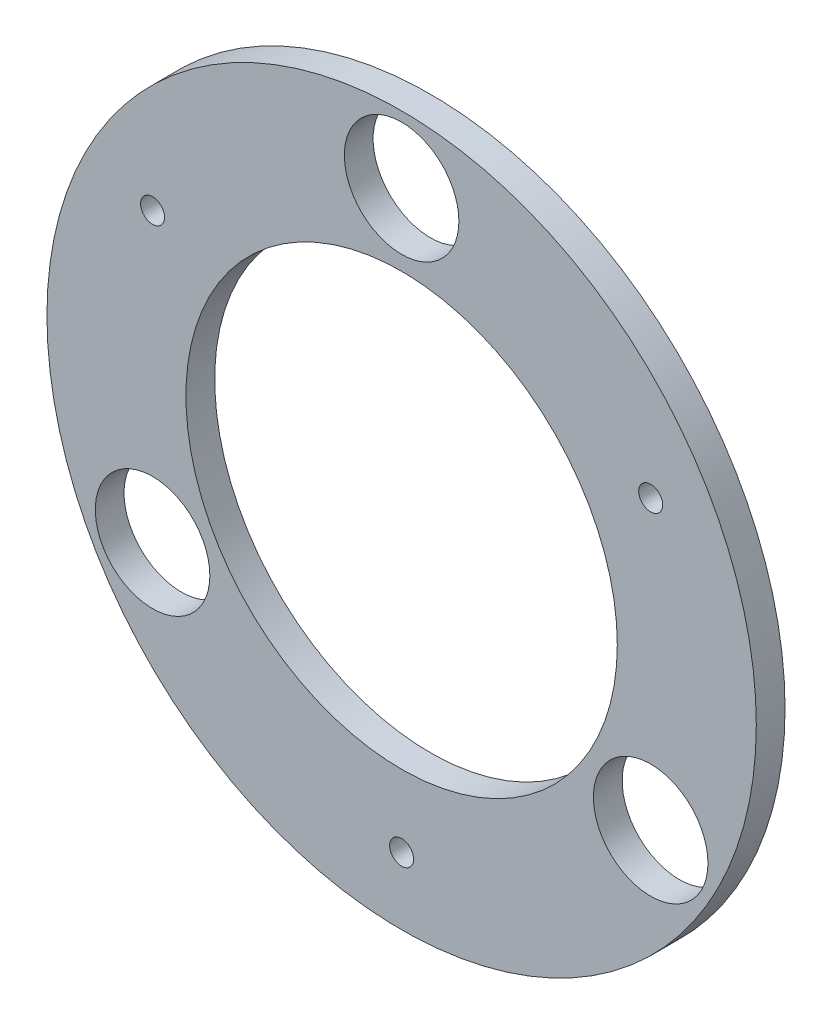
ISO-10303-21;
HEADER;
FILE_DESCRIPTION(('STEP AP214'),'2;1');
FILE_NAME('part.step','',(''),(''),'','','');
FILE_SCHEMA(('AUTOMOTIVE_DESIGN { 1 0 10303 214 1 1 1 1 }'));
ENDSEC;
DATA;
#1=APPLICATION_CONTEXT('core data for automotive mechanical design processes');
#2=APPLICATION_PROTOCOL_DEFINITION('international standard','automotive_design',2000,#1);
#3=PRODUCT_CONTEXT('',#1,'mechanical');
#4=PRODUCT('Part','Part','',(#3));
#5=PRODUCT_RELATED_PRODUCT_CATEGORY('part','',(#4));
#6=PRODUCT_DEFINITION_FORMATION('','',#4);
#7=PRODUCT_DEFINITION_CONTEXT('part definition',#1,'design');
#8=PRODUCT_DEFINITION('design','',#6,#7);
#9=PRODUCT_DEFINITION_SHAPE('','',#8);
#10=(LENGTH_UNIT() NAMED_UNIT(*) SI_UNIT(.MILLI.,.METRE.));
#11=(NAMED_UNIT(*) PLANE_ANGLE_UNIT() SI_UNIT($,.RADIAN.));
#12=(NAMED_UNIT(*) SI_UNIT($,.STERADIAN.) SOLID_ANGLE_UNIT());
#13=UNCERTAINTY_MEASURE_WITH_UNIT(LENGTH_MEASURE(1.E-05),#10,'distance_accuracy_value','');
#14=(GEOMETRIC_REPRESENTATION_CONTEXT(3) GLOBAL_UNCERTAINTY_ASSIGNED_CONTEXT((#13)) GLOBAL_UNIT_ASSIGNED_CONTEXT((#10,
#11,#12)) REPRESENTATION_CONTEXT('',''));
#15=CARTESIAN_POINT('',(0.,0.,0.));
#16=DIRECTION('',(0.,0.,1.));
#17=DIRECTION('',(1.,0.,0.));
#18=AXIS2_PLACEMENT_3D('',#15,#16,#17);
#19=CARTESIAN_POINT('',(0.,0.,3.));
#20=DIRECTION('',(0.,0.,1.));
#21=DIRECTION('',(1.,0.,0.));
#22=AXIS2_PLACEMENT_3D('',#19,#20,#21);
#23=PLANE('',#22);
#24=CARTESIAN_POINT('',(-25.9807621135332,15.,3.));
#25=DIRECTION('',(0.,0.,1.));
#26=DIRECTION('',(1.,0.,0.));
#27=AXIS2_PLACEMENT_3D('',#24,#25,#26);
#28=CIRCLE('',#27,1.25);
#29=CARTESIAN_POINT('',(-24.7307621135332,15.,3.));
#30=VERTEX_POINT('',#29);
#31=EDGE_CURVE('E55',#30,#30,#28,.T.);
#32=ORIENTED_EDGE('',*,*,#31,.F.);
#33=EDGE_LOOP('',(#32));
#34=FACE_BOUND('',#33,.T.);
#35=CARTESIAN_POINT('',(25.9807621135332,-15.,3.));
#36=DIRECTION('',(0.,0.,1.));
#37=DIRECTION('',(1.,0.,0.));
#38=AXIS2_PLACEMENT_3D('',#35,#36,#37);
#39=CIRCLE('',#38,5.975);
#40=CARTESIAN_POINT('',(31.9557621135332,-15.,3.));
#41=VERTEX_POINT('',#40);
#42=EDGE_CURVE('E43',#41,#41,#39,.T.);
#43=ORIENTED_EDGE('',*,*,#42,.F.);
#44=EDGE_LOOP('',(#43));
#45=FACE_BOUND('',#44,.T.);
#46=CARTESIAN_POINT('',(0.,30.,3.));
#47=DIRECTION('',(0.,0.,1.));
#48=DIRECTION('',(1.,0.,0.));
#49=AXIS2_PLACEMENT_3D('',#46,#47,#48);
#50=CIRCLE('',#49,5.975);
#51=CARTESIAN_POINT('',(5.97500000000001,30.,3.));
#52=VERTEX_POINT('',#51);
#53=EDGE_CURVE('E31',#52,#52,#50,.T.);
#54=ORIENTED_EDGE('',*,*,#53,.F.);
#55=EDGE_LOOP('',(#54));
#56=FACE_BOUND('',#55,.T.);
#57=CARTESIAN_POINT('',(0.,0.,3.));
#58=DIRECTION('',(0.,0.,1.));
#59=DIRECTION('',(1.,0.,0.));
#60=AXIS2_PLACEMENT_3D('',#57,#58,#59);
#61=CIRCLE('',#60,37.);
#62=CARTESIAN_POINT('',(37.,0.,3.));
#63=VERTEX_POINT('',#62);
#64=EDGE_CURVE('E10',#63,#63,#61,.T.);
#65=ORIENTED_EDGE('',*,*,#64,.T.);
#66=EDGE_LOOP('',(#65));
#67=FACE_BOUND('',#66,.T.);
#68=CARTESIAN_POINT('',(0.,0.,3.));
#69=DIRECTION('',(0.,0.,1.));
#70=DIRECTION('',(1.,0.,0.));
#71=AXIS2_PLACEMENT_3D('',#68,#69,#70);
#72=CIRCLE('',#71,22.5);
#73=CARTESIAN_POINT('',(22.5,0.,3.));
#74=VERTEX_POINT('',#73);
#75=EDGE_CURVE('E26',#74,#74,#72,.T.);
#76=ORIENTED_EDGE('',*,*,#75,.F.);
#77=EDGE_LOOP('',(#76));
#78=FACE_BOUND('',#77,.T.);
#79=CARTESIAN_POINT('',(-25.9807621135332,-15.,3.));
#80=DIRECTION('',(0.,0.,1.));
#81=DIRECTION('',(1.,0.,0.));
#82=AXIS2_PLACEMENT_3D('',#79,#80,#81);
#83=CIRCLE('',#82,5.975);
#84=CARTESIAN_POINT('',(-20.0057621135332,-15.,3.));
#85=VERTEX_POINT('',#84);
#86=EDGE_CURVE('E37',#85,#85,#83,.T.);
#87=ORIENTED_EDGE('',*,*,#86,.F.);
#88=EDGE_LOOP('',(#87));
#89=FACE_BOUND('',#88,.T.);
#90=CARTESIAN_POINT('',(25.9807621135332,15.,3.));
#91=DIRECTION('',(0.,0.,1.));
#92=DIRECTION('',(1.,0.,0.));
#93=AXIS2_PLACEMENT_3D('',#90,#91,#92);
#94=CIRCLE('',#93,1.25);
#95=CARTESIAN_POINT('',(27.2307621135332,15.,3.));
#96=VERTEX_POINT('',#95);
#97=EDGE_CURVE('E49',#96,#96,#94,.T.);
#98=ORIENTED_EDGE('',*,*,#97,.F.);
#99=EDGE_LOOP('',(#98));
#100=FACE_BOUND('',#99,.T.);
#101=CARTESIAN_POINT('',(0.,-30.,3.));
#102=DIRECTION('',(0.,0.,1.));
#103=DIRECTION('',(1.,0.,0.));
#104=AXIS2_PLACEMENT_3D('',#101,#102,#103);
#105=CIRCLE('',#104,1.25);
#106=CARTESIAN_POINT('',(1.25000000000001,-30.,3.));
#107=VERTEX_POINT('',#106);
#108=EDGE_CURVE('E61',#107,#107,#105,.T.);
#109=ORIENTED_EDGE('',*,*,#108,.F.);
#110=EDGE_LOOP('',(#109));
#111=FACE_BOUND('',#110,.T.);
#112=ADVANCED_FACE('F15',(#34,#45,#56,#67,#78,#89,#100,#111),#23,.T.);
#113=CARTESIAN_POINT('',(0.,0.,0.));
#114=DIRECTION('',(0.,0.,1.));
#115=DIRECTION('',(1.,0.,0.));
#116=AXIS2_PLACEMENT_3D('',#113,#114,#115);
#117=PLANE('',#116);
#118=CARTESIAN_POINT('',(0.,0.,0.));
#119=DIRECTION('',(0.,0.,1.));
#120=DIRECTION('',(1.,0.,0.));
#121=AXIS2_PLACEMENT_3D('',#118,#119,#120);
#122=CIRCLE('',#121,37.);
#123=CARTESIAN_POINT('',(37.,0.,0.));
#124=VERTEX_POINT('',#123);
#125=EDGE_CURVE('E19',#124,#124,#122,.T.);
#126=ORIENTED_EDGE('',*,*,#125,.F.);
#127=EDGE_LOOP('',(#126));
#128=FACE_BOUND('',#127,.T.);
#129=CARTESIAN_POINT('',(0.,0.,0.));
#130=DIRECTION('',(0.,0.,1.));
#131=DIRECTION('',(1.,0.,0.));
#132=AXIS2_PLACEMENT_3D('',#129,#130,#131);
#133=CIRCLE('',#132,22.5);
#134=CARTESIAN_POINT('',(22.5,0.,0.));
#135=VERTEX_POINT('',#134);
#136=EDGE_CURVE('E28',#135,#135,#133,.T.);
#137=ORIENTED_EDGE('',*,*,#136,.T.);
#138=EDGE_LOOP('',(#137));
#139=FACE_BOUND('',#138,.T.);
#140=CARTESIAN_POINT('',(0.,30.,0.));
#141=DIRECTION('',(0.,0.,1.));
#142=DIRECTION('',(1.,0.,0.));
#143=AXIS2_PLACEMENT_3D('',#140,#141,#142);
#144=CIRCLE('',#143,5.975);
#145=CARTESIAN_POINT('',(5.97500000000001,30.,0.));
#146=VERTEX_POINT('',#145);
#147=EDGE_CURVE('E34',#146,#146,#144,.T.);
#148=ORIENTED_EDGE('',*,*,#147,.T.);
#149=EDGE_LOOP('',(#148));
#150=FACE_BOUND('',#149,.T.);
#151=CARTESIAN_POINT('',(-25.9807621135332,-15.,0.));
#152=DIRECTION('',(0.,0.,1.));
#153=DIRECTION('',(1.,0.,0.));
#154=AXIS2_PLACEMENT_3D('',#151,#152,#153);
#155=CIRCLE('',#154,5.975);
#156=CARTESIAN_POINT('',(-20.0057621135332,-15.,0.));
#157=VERTEX_POINT('',#156);
#158=EDGE_CURVE('E40',#157,#157,#155,.T.);
#159=ORIENTED_EDGE('',*,*,#158,.T.);
#160=EDGE_LOOP('',(#159));
#161=FACE_BOUND('',#160,.T.);
#162=CARTESIAN_POINT('',(25.9807621135332,-15.,0.));
#163=DIRECTION('',(0.,0.,1.));
#164=DIRECTION('',(1.,0.,0.));
#165=AXIS2_PLACEMENT_3D('',#162,#163,#164);
#166=CIRCLE('',#165,5.975);
#167=CARTESIAN_POINT('',(31.9557621135332,-15.,0.));
#168=VERTEX_POINT('',#167);
#169=EDGE_CURVE('E46',#168,#168,#166,.T.);
#170=ORIENTED_EDGE('',*,*,#169,.T.);
#171=EDGE_LOOP('',(#170));
#172=FACE_BOUND('',#171,.T.);
#173=CARTESIAN_POINT('',(25.9807621135332,15.,0.));
#174=DIRECTION('',(0.,0.,1.));
#175=DIRECTION('',(1.,0.,0.));
#176=AXIS2_PLACEMENT_3D('',#173,#174,#175);
#177=CIRCLE('',#176,1.25);
#178=CARTESIAN_POINT('',(27.2307621135332,15.,0.));
#179=VERTEX_POINT('',#178);
#180=EDGE_CURVE('E52',#179,#179,#177,.T.);
#181=ORIENTED_EDGE('',*,*,#180,.T.);
#182=EDGE_LOOP('',(#181));
#183=FACE_BOUND('',#182,.T.);
#184=CARTESIAN_POINT('',(-25.9807621135332,15.,0.));
#185=DIRECTION('',(0.,0.,1.));
#186=DIRECTION('',(1.,0.,0.));
#187=AXIS2_PLACEMENT_3D('',#184,#185,#186);
#188=CIRCLE('',#187,1.25);
#189=CARTESIAN_POINT('',(-24.7307621135332,15.,0.));
#190=VERTEX_POINT('',#189);
#191=EDGE_CURVE('E58',#190,#190,#188,.T.);
#192=ORIENTED_EDGE('',*,*,#191,.T.);
#193=EDGE_LOOP('',(#192));
#194=FACE_BOUND('',#193,.T.);
#195=CARTESIAN_POINT('',(0.,-30.,0.));
#196=DIRECTION('',(0.,0.,1.));
#197=DIRECTION('',(1.,0.,0.));
#198=AXIS2_PLACEMENT_3D('',#195,#196,#197);
#199=CIRCLE('',#198,1.25);
#200=CARTESIAN_POINT('',(1.25000000000001,-30.,0.));
#201=VERTEX_POINT('',#200);
#202=EDGE_CURVE('E64',#201,#201,#199,.T.);
#203=ORIENTED_EDGE('',*,*,#202,.T.);
#204=EDGE_LOOP('',(#203));
#205=FACE_BOUND('',#204,.T.);
#206=ADVANCED_FACE('F74',(#128,#139,#150,#161,#172,#183,#194,#205),#117,.F.);
#207=CARTESIAN_POINT('',(0.,0.,3.));
#208=DIRECTION('',(0.,0.,-1.));
#209=DIRECTION('',(-1.,0.,0.));
#210=AXIS2_PLACEMENT_3D('',#207,#208,#209);
#211=CYLINDRICAL_SURFACE('',#210,37.);
#212=ORIENTED_EDGE('',*,*,#64,.F.);
#213=EDGE_LOOP('',(#212));
#214=FACE_BOUND('',#213,.T.);
#215=ORIENTED_EDGE('',*,*,#125,.T.);
#216=EDGE_LOOP('',(#215));
#217=FACE_BOUND('',#216,.T.);
#218=ADVANCED_FACE('F17',(#214,#217),#211,.T.);
#219=CARTESIAN_POINT('',(0.,0.,3.));
#220=DIRECTION('',(0.,0.,-1.));
#221=DIRECTION('',(-1.,0.,0.));
#222=AXIS2_PLACEMENT_3D('',#219,#220,#221);
#223=CYLINDRICAL_SURFACE('',#222,22.5);
#224=ORIENTED_EDGE('',*,*,#75,.T.);
#225=EDGE_LOOP('',(#224));
#226=FACE_BOUND('',#225,.T.);
#227=ORIENTED_EDGE('',*,*,#136,.F.);
#228=EDGE_LOOP('',(#227));
#229=FACE_BOUND('',#228,.T.);
#230=ADVANCED_FACE('F86',(#226,#229),#223,.F.);
#231=CARTESIAN_POINT('',(0.,30.,3.));
#232=DIRECTION('',(0.,0.,-1.));
#233=DIRECTION('',(-1.,0.,0.));
#234=AXIS2_PLACEMENT_3D('',#231,#232,#233);
#235=CYLINDRICAL_SURFACE('',#234,5.975);
#236=ORIENTED_EDGE('',*,*,#53,.T.);
#237=EDGE_LOOP('',(#236));
#238=FACE_BOUND('',#237,.T.);
#239=ORIENTED_EDGE('',*,*,#147,.F.);
#240=EDGE_LOOP('',(#239));
#241=FACE_BOUND('',#240,.T.);
#242=ADVANCED_FACE('F89',(#238,#241),#235,.F.);
#243=CARTESIAN_POINT('',(-25.9807621135332,-15.,3.));
#244=DIRECTION('',(0.,0.,-1.));
#245=DIRECTION('',(-1.,0.,0.));
#246=AXIS2_PLACEMENT_3D('',#243,#244,#245);
#247=CYLINDRICAL_SURFACE('',#246,5.975);
#248=ORIENTED_EDGE('',*,*,#86,.T.);
#249=EDGE_LOOP('',(#248));
#250=FACE_BOUND('',#249,.T.);
#251=ORIENTED_EDGE('',*,*,#158,.F.);
#252=EDGE_LOOP('',(#251));
#253=FACE_BOUND('',#252,.T.);
#254=ADVANCED_FACE('F93',(#250,#253),#247,.F.);
#255=CARTESIAN_POINT('',(25.9807621135332,-15.,3.));
#256=DIRECTION('',(0.,0.,-1.));
#257=DIRECTION('',(-1.,0.,0.));
#258=AXIS2_PLACEMENT_3D('',#255,#256,#257);
#259=CYLINDRICAL_SURFACE('',#258,5.975);
#260=ORIENTED_EDGE('',*,*,#42,.T.);
#261=EDGE_LOOP('',(#260));
#262=FACE_BOUND('',#261,.T.);
#263=ORIENTED_EDGE('',*,*,#169,.F.);
#264=EDGE_LOOP('',(#263));
#265=FACE_BOUND('',#264,.T.);
#266=ADVANCED_FACE('F97',(#262,#265),#259,.F.);
#267=CARTESIAN_POINT('',(25.9807621135332,15.,3.));
#268=DIRECTION('',(0.,0.,-1.));
#269=DIRECTION('',(-1.,0.,0.));
#270=AXIS2_PLACEMENT_3D('',#267,#268,#269);
#271=CYLINDRICAL_SURFACE('',#270,1.25);
#272=ORIENTED_EDGE('',*,*,#97,.T.);
#273=EDGE_LOOP('',(#272));
#274=FACE_BOUND('',#273,.T.);
#275=ORIENTED_EDGE('',*,*,#180,.F.);
#276=EDGE_LOOP('',(#275));
#277=FACE_BOUND('',#276,.T.);
#278=ADVANCED_FACE('F101',(#274,#277),#271,.F.);
#279=CARTESIAN_POINT('',(-25.9807621135332,15.,3.));
#280=DIRECTION('',(0.,0.,-1.));
#281=DIRECTION('',(-1.,0.,0.));
#282=AXIS2_PLACEMENT_3D('',#279,#280,#281);
#283=CYLINDRICAL_SURFACE('',#282,1.25);
#284=ORIENTED_EDGE('',*,*,#31,.T.);
#285=EDGE_LOOP('',(#284));
#286=FACE_BOUND('',#285,.T.);
#287=ORIENTED_EDGE('',*,*,#191,.F.);
#288=EDGE_LOOP('',(#287));
#289=FACE_BOUND('',#288,.T.);
#290=ADVANCED_FACE('F105',(#286,#289),#283,.F.);
#291=CARTESIAN_POINT('',(0.,-30.,3.));
#292=DIRECTION('',(0.,0.,-1.));
#293=DIRECTION('',(-1.,0.,0.));
#294=AXIS2_PLACEMENT_3D('',#291,#292,#293);
#295=CYLINDRICAL_SURFACE('',#294,1.25);
#296=ORIENTED_EDGE('',*,*,#108,.T.);
#297=EDGE_LOOP('',(#296));
#298=FACE_BOUND('',#297,.T.);
#299=ORIENTED_EDGE('',*,*,#202,.F.);
#300=EDGE_LOOP('',(#299));
#301=FACE_BOUND('',#300,.T.);
#302=ADVANCED_FACE('F70',(#298,#301),#295,.F.);
#303=CLOSED_SHELL('',(#112,#206,#218,#230,#242,#254,#266,#278,#290,#302));
#304=MANIFOLD_SOLID_BREP('B1',#303);
#305=ADVANCED_BREP_SHAPE_REPRESENTATION('',(#18,#304),#14);
#306=SHAPE_DEFINITION_REPRESENTATION(#9,#305);
ENDSEC;
END-ISO-10303-21;
